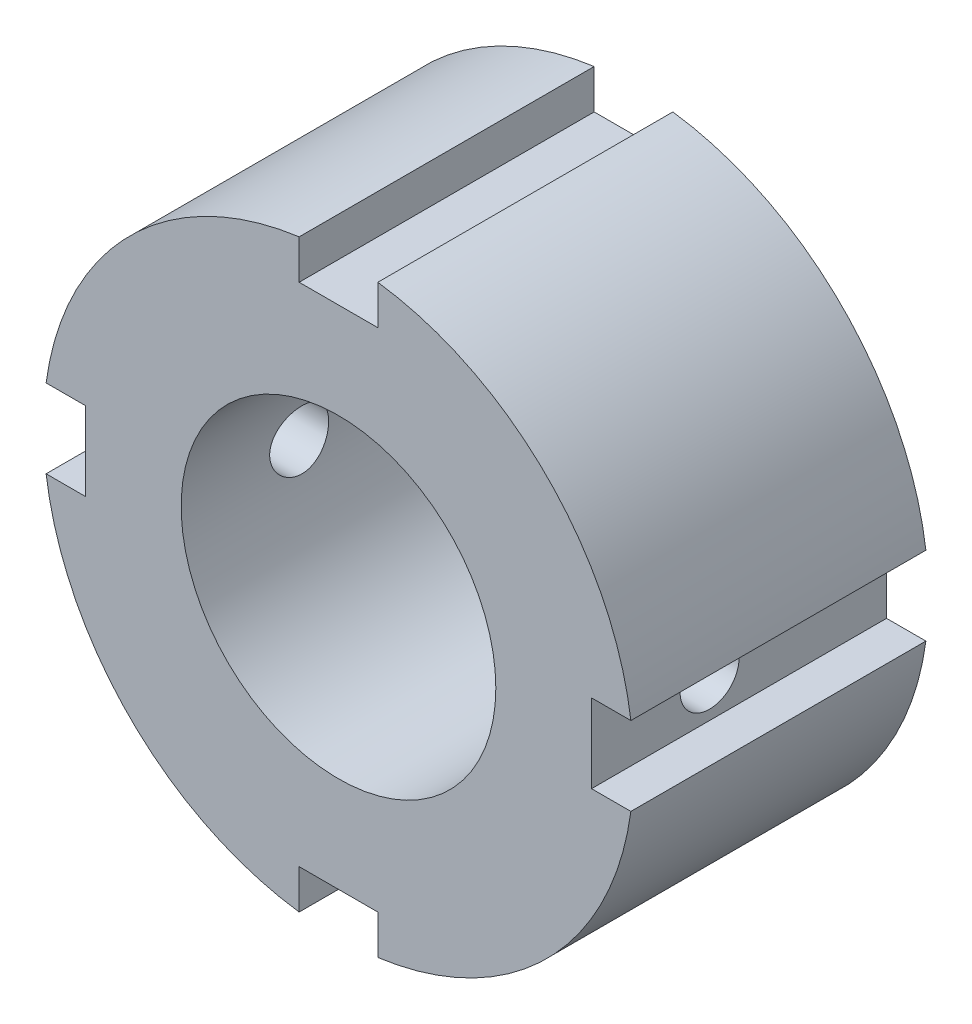
ISO-10303-21;
HEADER;
FILE_DESCRIPTION(('STEP AP214'),'2;1');
FILE_NAME('part.step','',(''),(''),'','','');
FILE_SCHEMA(('AUTOMOTIVE_DESIGN { 1 0 10303 214 1 1 1 1 }'));
ENDSEC;
DATA;
#1=APPLICATION_CONTEXT('core data for automotive mechanical design processes');
#2=APPLICATION_PROTOCOL_DEFINITION('international standard','automotive_design',2000,#1);
#3=PRODUCT_CONTEXT('',#1,'mechanical');
#4=PRODUCT('Part','Part','',(#3));
#5=PRODUCT_RELATED_PRODUCT_CATEGORY('part','',(#4));
#6=PRODUCT_DEFINITION_FORMATION('','',#4);
#7=PRODUCT_DEFINITION_CONTEXT('part definition',#1,'design');
#8=PRODUCT_DEFINITION('design','',#6,#7);
#9=PRODUCT_DEFINITION_SHAPE('','',#8);
#10=(LENGTH_UNIT() NAMED_UNIT(*) SI_UNIT(.MILLI.,.METRE.));
#11=(NAMED_UNIT(*) PLANE_ANGLE_UNIT() SI_UNIT($,.RADIAN.));
#12=(NAMED_UNIT(*) SI_UNIT($,.STERADIAN.) SOLID_ANGLE_UNIT());
#13=UNCERTAINTY_MEASURE_WITH_UNIT(LENGTH_MEASURE(1.E-05),#10,'distance_accuracy_value','');
#14=(GEOMETRIC_REPRESENTATION_CONTEXT(3) GLOBAL_UNCERTAINTY_ASSIGNED_CONTEXT((#13)) GLOBAL_UNIT_ASSIGNED_CONTEXT((#10,
#11,#12)) REPRESENTATION_CONTEXT('',''));
#15=CARTESIAN_POINT('',(0.,0.,0.));
#16=DIRECTION('',(0.,0.,1.));
#17=DIRECTION('',(1.,0.,0.));
#18=AXIS2_PLACEMENT_3D('',#15,#16,#17);
#19=CARTESIAN_POINT('',(0.,2.,15.));
#20=DIRECTION('',(0.,1.,0.));
#21=DIRECTION('',(0.,0.,1.));
#22=AXIS2_PLACEMENT_3D('',#19,#20,#21);
#23=PLANE('',#22);
#24=DIRECTION('',(1.,0.,0.));
#25=VECTOR('',#24,1.);
#26=CARTESIAN_POINT('',(0.,2.,0.));
#27=LINE('',#26,#25);
#28=CARTESIAN_POINT('',(12.8660687473185,2.,0.));
#29=VERTEX_POINT('',#28);
#30=CARTESIAN_POINT('',(14.8660687473185,2.,0.));
#31=VERTEX_POINT('',#30);
#32=EDGE_CURVE('E200',#29,#31,#27,.T.);
#33=ORIENTED_EDGE('',*,*,#32,.T.);
#34=DIRECTION('',(0.,0.,-1.));
#35=VECTOR('',#34,1.);
#36=CARTESIAN_POINT('',(14.8660687473185,2.,15.));
#37=LINE('',#36,#35);
#38=CARTESIAN_POINT('',(14.8660687473185,2.,15.));
#39=VERTEX_POINT('',#38);
#40=EDGE_CURVE('E11',#39,#31,#37,.T.);
#41=ORIENTED_EDGE('',*,*,#40,.F.);
#42=DIRECTION('',(1.,0.,0.));
#43=VECTOR('',#42,1.);
#44=CARTESIAN_POINT('',(0.,2.,15.));
#45=LINE('',#44,#43);
#46=CARTESIAN_POINT('',(12.8660687473185,2.,15.));
#47=VERTEX_POINT('',#46);
#48=EDGE_CURVE('E315',#47,#39,#45,.T.);
#49=ORIENTED_EDGE('',*,*,#48,.F.);
#50=DIRECTION('',(0.,0.,-1.));
#51=VECTOR('',#50,1.);
#52=CARTESIAN_POINT('',(12.8660687473185,2.,15.));
#53=LINE('',#52,#51);
#54=EDGE_CURVE('E61',#47,#29,#53,.T.);
#55=ORIENTED_EDGE('',*,*,#54,.T.);
#56=EDGE_LOOP('',(#33,#41,#49,#55));
#57=FACE_BOUND('',#56,.T.);
#58=ADVANCED_FACE('F41',(#57),#23,.F.);
#59=CARTESIAN_POINT('',(0.,0.,15.));
#60=DIRECTION('',(0.,0.,-1.));
#61=DIRECTION('',(-1.,0.,0.));
#62=AXIS2_PLACEMENT_3D('',#59,#60,#61);
#63=CYLINDRICAL_SURFACE('',#62,15.);
#64=CARTESIAN_POINT('',(0.,0.,0.));
#65=DIRECTION('',(0.,0.,1.));
#66=DIRECTION('',(1.,0.,0.));
#67=AXIS2_PLACEMENT_3D('',#64,#65,#66);
#68=CIRCLE('',#67,15.);
#69=CARTESIAN_POINT('',(2.,14.8660687473185,0.));
#70=VERTEX_POINT('',#69);
#71=EDGE_CURVE('E204',#31,#70,#68,.T.);
#72=ORIENTED_EDGE('',*,*,#71,.T.);
#73=DIRECTION('',(0.,0.,-1.));
#74=VECTOR('',#73,1.);
#75=CARTESIAN_POINT('',(2.,14.8660687473185,15.));
#76=LINE('',#75,#74);
#77=CARTESIAN_POINT('',(2.,14.8660687473185,15.));
#78=VERTEX_POINT('',#77);
#79=EDGE_CURVE('E53',#78,#70,#76,.T.);
#80=ORIENTED_EDGE('',*,*,#79,.F.);
#81=CARTESIAN_POINT('',(0.,0.,15.));
#82=DIRECTION('',(0.,0.,1.));
#83=DIRECTION('',(1.,0.,0.));
#84=AXIS2_PLACEMENT_3D('',#81,#82,#83);
#85=CIRCLE('',#84,15.);
#86=EDGE_CURVE('E123',#39,#78,#85,.T.);
#87=ORIENTED_EDGE('',*,*,#86,.F.);
#88=ORIENTED_EDGE('',*,*,#40,.T.);
#89=EDGE_LOOP('',(#72,#80,#87,#88));
#90=FACE_BOUND('',#89,.T.);
#91=ADVANCED_FACE('F296',(#90),#63,.T.);
#92=CARTESIAN_POINT('',(2.00000000000001,0.,15.));
#93=DIRECTION('',(-1.,0.,0.));
#94=DIRECTION('',(0.,-1.,0.));
#95=AXIS2_PLACEMENT_3D('',#92,#93,#94);
#96=PLANE('',#95);
#97=DIRECTION('',(0.,1.,0.));
#98=VECTOR('',#97,1.);
#99=CARTESIAN_POINT('',(2.00000000000001,0.,0.));
#100=LINE('',#99,#98);
#101=CARTESIAN_POINT('',(2.,12.8660687473185,0.));
#102=VERTEX_POINT('',#101);
#103=EDGE_CURVE('E208',#102,#70,#100,.T.);
#104=ORIENTED_EDGE('',*,*,#103,.F.);
#105=DIRECTION('',(0.,0.,-1.));
#106=VECTOR('',#105,1.);
#107=CARTESIAN_POINT('',(2.,12.8660687473185,15.));
#108=LINE('',#107,#106);
#109=CARTESIAN_POINT('',(2.,12.8660687473185,15.));
#110=VERTEX_POINT('',#109);
#111=EDGE_CURVE('E286',#110,#102,#108,.T.);
#112=ORIENTED_EDGE('',*,*,#111,.F.);
#113=DIRECTION('',(0.,1.,0.));
#114=VECTOR('',#113,1.);
#115=CARTESIAN_POINT('',(2.00000000000001,0.,15.));
#116=LINE('',#115,#114);
#117=EDGE_CURVE('E295',#110,#78,#116,.T.);
#118=ORIENTED_EDGE('',*,*,#117,.T.);
#119=ORIENTED_EDGE('',*,*,#79,.T.);
#120=EDGE_LOOP('',(#104,#112,#118,#119));
#121=FACE_BOUND('',#120,.T.);
#122=ADVANCED_FACE('F293',(#121),#96,.T.);
#123=CARTESIAN_POINT('',(0.,12.8660687473185,15.));
#124=DIRECTION('',(0.,1.,0.));
#125=DIRECTION('',(0.,0.,1.));
#126=AXIS2_PLACEMENT_3D('',#123,#124,#125);
#127=PLANE('',#126);
#128=DIRECTION('',(1.,0.,0.));
#129=VECTOR('',#128,1.);
#130=CARTESIAN_POINT('',(0.,12.8660687473185,0.));
#131=LINE('',#130,#129);
#132=CARTESIAN_POINT('',(-2.,12.8660687473185,0.));
#133=VERTEX_POINT('',#132);
#134=EDGE_CURVE('E213',#133,#102,#131,.T.);
#135=ORIENTED_EDGE('',*,*,#134,.F.);
#136=DIRECTION('',(0.,0.,-1.));
#137=VECTOR('',#136,1.);
#138=CARTESIAN_POINT('',(-2.,12.8660687473185,15.));
#139=LINE('',#138,#137);
#140=CARTESIAN_POINT('',(-2.,12.8660687473185,15.));
#141=VERTEX_POINT('',#140);
#142=EDGE_CURVE('E283',#141,#133,#139,.T.);
#143=ORIENTED_EDGE('',*,*,#142,.F.);
#144=DIRECTION('',(1.,0.,0.));
#145=VECTOR('',#144,1.);
#146=CARTESIAN_POINT('',(0.,12.8660687473185,15.));
#147=LINE('',#146,#145);
#148=EDGE_CURVE('E308',#141,#110,#147,.T.);
#149=ORIENTED_EDGE('',*,*,#148,.T.);
#150=ORIENTED_EDGE('',*,*,#111,.T.);
#151=EDGE_LOOP('',(#135,#143,#149,#150));
#152=FACE_BOUND('',#151,.T.);
#153=ADVANCED_FACE('F304',(#152),#127,.T.);
#154=CARTESIAN_POINT('',(-2.00000000000001,0.,15.));
#155=DIRECTION('',(-1.,0.,0.));
#156=DIRECTION('',(0.,-1.,0.));
#157=AXIS2_PLACEMENT_3D('',#154,#155,#156);
#158=PLANE('',#157);
#159=DIRECTION('',(0.,1.,0.));
#160=VECTOR('',#159,1.);
#161=CARTESIAN_POINT('',(-2.00000000000001,0.,0.));
#162=LINE('',#161,#160);
#163=CARTESIAN_POINT('',(-2.,14.8660687473185,0.));
#164=VERTEX_POINT('',#163);
#165=EDGE_CURVE('E217',#133,#164,#162,.T.);
#166=ORIENTED_EDGE('',*,*,#165,.T.);
#167=DIRECTION('',(0.,0.,-1.));
#168=VECTOR('',#167,1.);
#169=CARTESIAN_POINT('',(-2.,14.8660687473185,15.));
#170=LINE('',#169,#168);
#171=CARTESIAN_POINT('',(-2.,14.8660687473185,15.));
#172=VERTEX_POINT('',#171);
#173=EDGE_CURVE('E279',#172,#164,#170,.T.);
#174=ORIENTED_EDGE('',*,*,#173,.F.);
#175=DIRECTION('',(0.,1.,0.));
#176=VECTOR('',#175,1.);
#177=CARTESIAN_POINT('',(-2.00000000000001,0.,15.));
#178=LINE('',#177,#176);
#179=EDGE_CURVE('E313',#141,#172,#178,.T.);
#180=ORIENTED_EDGE('',*,*,#179,.F.);
#181=ORIENTED_EDGE('',*,*,#142,.T.);
#182=EDGE_LOOP('',(#166,#174,#180,#181));
#183=FACE_BOUND('',#182,.T.);
#184=ADVANCED_FACE('F400',(#183),#158,.F.);
#185=CARTESIAN_POINT('',(-14.8660687473185,2.,0.));
#186=VERTEX_POINT('',#185);
#187=EDGE_CURVE('E209',#164,#186,#68,.T.);
#188=ORIENTED_EDGE('',*,*,#187,.T.);
#189=DIRECTION('',(0.,0.,-1.));
#190=VECTOR('',#189,1.);
#191=CARTESIAN_POINT('',(-14.8660687473185,2.,15.));
#192=LINE('',#191,#190);
#193=CARTESIAN_POINT('',(-14.8660687473185,2.,15.));
#194=VERTEX_POINT('',#193);
#195=EDGE_CURVE('E276',#194,#186,#192,.T.);
#196=ORIENTED_EDGE('',*,*,#195,.F.);
#197=EDGE_CURVE('E316',#172,#194,#85,.T.);
#198=ORIENTED_EDGE('',*,*,#197,.F.);
#199=ORIENTED_EDGE('',*,*,#173,.T.);
#200=EDGE_LOOP('',(#188,#196,#198,#199));
#201=FACE_BOUND('',#200,.T.);
#202=ADVANCED_FACE('F356',(#201),#63,.T.);
#203=CARTESIAN_POINT('',(0.,2.,15.));
#204=DIRECTION('',(0.,-1.,0.));
#205=DIRECTION('',(0.,0.,-1.));
#206=AXIS2_PLACEMENT_3D('',#203,#204,#205);
#207=PLANE('',#206);
#208=DIRECTION('',(-1.,0.,0.));
#209=VECTOR('',#208,1.);
#210=CARTESIAN_POINT('',(0.,2.,0.));
#211=LINE('',#210,#209);
#212=CARTESIAN_POINT('',(-12.8660687473185,2.,0.));
#213=VERTEX_POINT('',#212);
#214=EDGE_CURVE('E220',#213,#186,#211,.T.);
#215=ORIENTED_EDGE('',*,*,#214,.F.);
#216=DIRECTION('',(0.,0.,-1.));
#217=VECTOR('',#216,1.);
#218=CARTESIAN_POINT('',(-12.8660687473185,2.,15.));
#219=LINE('',#218,#217);
#220=CARTESIAN_POINT('',(-12.8660687473185,2.,15.));
#221=VERTEX_POINT('',#220);
#222=EDGE_CURVE('E273',#221,#213,#219,.T.);
#223=ORIENTED_EDGE('',*,*,#222,.F.);
#224=DIRECTION('',(-1.,0.,0.));
#225=VECTOR('',#224,1.);
#226=CARTESIAN_POINT('',(0.,2.,15.));
#227=LINE('',#226,#225);
#228=EDGE_CURVE('E321',#221,#194,#227,.T.);
#229=ORIENTED_EDGE('',*,*,#228,.T.);
#230=ORIENTED_EDGE('',*,*,#195,.T.);
#231=EDGE_LOOP('',(#215,#223,#229,#230));
#232=FACE_BOUND('',#231,.T.);
#233=ADVANCED_FACE('F363',(#232),#207,.T.);
#234=CARTESIAN_POINT('',(-12.8660687473185,0.,15.));
#235=DIRECTION('',(1.,0.,0.));
#236=DIRECTION('',(0.,0.,-1.));
#237=AXIS2_PLACEMENT_3D('',#234,#235,#236);
#238=PLANE('',#237);
#239=CARTESIAN_POINT('',(-12.8660687473185,0.,9.));
#240=DIRECTION('',(1.,0.,0.));
#241=DIRECTION('',(0.,0.,-1.));
#242=AXIS2_PLACEMENT_3D('',#239,#240,#241);
#243=CIRCLE('',#242,1.5);
#244=CARTESIAN_POINT('',(-12.8660687473185,0.,7.5));
#245=VERTEX_POINT('',#244);
#246=EDGE_CURVE('E201',#245,#245,#243,.T.);
#247=ORIENTED_EDGE('',*,*,#246,.T.);
#248=EDGE_LOOP('',(#247));
#249=FACE_BOUND('',#248,.T.);
#250=DIRECTION('',(0.,-1.,0.));
#251=VECTOR('',#250,1.);
#252=CARTESIAN_POINT('',(-12.8660687473185,0.,0.));
#253=LINE('',#252,#251);
#254=CARTESIAN_POINT('',(-12.8660687473185,-2.,0.));
#255=VERTEX_POINT('',#254);
#256=EDGE_CURVE('E224',#213,#255,#253,.T.);
#257=ORIENTED_EDGE('',*,*,#256,.T.);
#258=DIRECTION('',(0.,0.,-1.));
#259=VECTOR('',#258,1.);
#260=CARTESIAN_POINT('',(-12.8660687473185,-2.,15.));
#261=LINE('',#260,#259);
#262=CARTESIAN_POINT('',(-12.8660687473185,-2.,15.));
#263=VERTEX_POINT('',#262);
#264=EDGE_CURVE('E269',#263,#255,#261,.T.);
#265=ORIENTED_EDGE('',*,*,#264,.F.);
#266=DIRECTION('',(0.,-1.,0.));
#267=VECTOR('',#266,1.);
#268=CARTESIAN_POINT('',(-12.8660687473185,0.,15.));
#269=LINE('',#268,#267);
#270=EDGE_CURVE('E325',#221,#263,#269,.T.);
#271=ORIENTED_EDGE('',*,*,#270,.F.);
#272=ORIENTED_EDGE('',*,*,#222,.T.);
#273=EDGE_LOOP('',(#257,#265,#271,#272));
#274=FACE_BOUND('',#273,.T.);
#275=ADVANCED_FACE('F379',(#249,#274),#238,.F.);
#276=CARTESIAN_POINT('',(0.,-2.,15.));
#277=DIRECTION('',(0.,-1.,0.));
#278=DIRECTION('',(0.,0.,-1.));
#279=AXIS2_PLACEMENT_3D('',#276,#277,#278);
#280=PLANE('',#279);
#281=DIRECTION('',(-1.,0.,0.));
#282=VECTOR('',#281,1.);
#283=CARTESIAN_POINT('',(0.,-2.,0.));
#284=LINE('',#283,#282);
#285=CARTESIAN_POINT('',(-14.8660687473185,-2.,0.));
#286=VERTEX_POINT('',#285);
#287=EDGE_CURVE('E227',#255,#286,#284,.T.);
#288=ORIENTED_EDGE('',*,*,#287,.T.);
#289=DIRECTION('',(0.,0.,-1.));
#290=VECTOR('',#289,1.);
#291=CARTESIAN_POINT('',(-14.8660687473185,-2.,15.));
#292=LINE('',#291,#290);
#293=CARTESIAN_POINT('',(-14.8660687473185,-2.,15.));
#294=VERTEX_POINT('',#293);
#295=EDGE_CURVE('E265',#294,#286,#292,.T.);
#296=ORIENTED_EDGE('',*,*,#295,.F.);
#297=DIRECTION('',(-1.,0.,0.));
#298=VECTOR('',#297,1.);
#299=CARTESIAN_POINT('',(0.,-2.,15.));
#300=LINE('',#299,#298);
#301=EDGE_CURVE('E328',#263,#294,#300,.T.);
#302=ORIENTED_EDGE('',*,*,#301,.F.);
#303=ORIENTED_EDGE('',*,*,#264,.T.);
#304=EDGE_LOOP('',(#288,#296,#302,#303));
#305=FACE_BOUND('',#304,.T.);
#306=ADVANCED_FACE('F377',(#305),#280,.F.);
#307=CARTESIAN_POINT('',(-2.,-14.8660687473185,0.));
#308=VERTEX_POINT('',#307);
#309=EDGE_CURVE('E230',#286,#308,#68,.T.);
#310=ORIENTED_EDGE('',*,*,#309,.T.);
#311=DIRECTION('',(0.,0.,-1.));
#312=VECTOR('',#311,1.);
#313=CARTESIAN_POINT('',(-2.,-14.8660687473185,15.));
#314=LINE('',#313,#312);
#315=CARTESIAN_POINT('',(-2.,-14.8660687473185,15.));
#316=VERTEX_POINT('',#315);
#317=EDGE_CURVE('E262',#316,#308,#314,.T.);
#318=ORIENTED_EDGE('',*,*,#317,.F.);
#319=EDGE_CURVE('E176',#294,#316,#85,.T.);
#320=ORIENTED_EDGE('',*,*,#319,.F.);
#321=ORIENTED_EDGE('',*,*,#295,.T.);
#322=EDGE_LOOP('',(#310,#318,#320,#321));
#323=FACE_BOUND('',#322,.T.);
#324=ADVANCED_FACE('F372',(#323),#63,.T.);
#325=CARTESIAN_POINT('',(-2.00000000000001,0.,15.));
#326=DIRECTION('',(1.,0.,0.));
#327=DIRECTION('',(0.,1.,0.));
#328=AXIS2_PLACEMENT_3D('',#325,#326,#327);
#329=PLANE('',#328);
#330=DIRECTION('',(0.,-1.,0.));
#331=VECTOR('',#330,1.);
#332=CARTESIAN_POINT('',(-2.00000000000001,0.,0.));
#333=LINE('',#332,#331);
#334=CARTESIAN_POINT('',(-2.,-12.8660687473185,0.));
#335=VERTEX_POINT('',#334);
#336=EDGE_CURVE('E231',#335,#308,#333,.T.);
#337=ORIENTED_EDGE('',*,*,#336,.F.);
#338=DIRECTION('',(0.,0.,-1.));
#339=VECTOR('',#338,1.);
#340=CARTESIAN_POINT('',(-2.,-12.8660687473185,15.));
#341=LINE('',#340,#339);
#342=CARTESIAN_POINT('',(-2.,-12.8660687473185,15.));
#343=VERTEX_POINT('',#342);
#344=EDGE_CURVE('E259',#343,#335,#341,.T.);
#345=ORIENTED_EDGE('',*,*,#344,.F.);
#346=DIRECTION('',(0.,-1.,0.));
#347=VECTOR('',#346,1.);
#348=CARTESIAN_POINT('',(-2.00000000000001,0.,15.));
#349=LINE('',#348,#347);
#350=EDGE_CURVE('E331',#343,#316,#349,.T.);
#351=ORIENTED_EDGE('',*,*,#350,.T.);
#352=ORIENTED_EDGE('',*,*,#317,.T.);
#353=EDGE_LOOP('',(#337,#345,#351,#352));
#354=FACE_BOUND('',#353,.T.);
#355=ADVANCED_FACE('F375',(#354),#329,.T.);
#356=CARTESIAN_POINT('',(0.,-12.8660687473185,15.));
#357=DIRECTION('',(0.,1.,0.));
#358=DIRECTION('',(0.,0.,1.));
#359=AXIS2_PLACEMENT_3D('',#356,#357,#358);
#360=PLANE('',#359);
#361=DIRECTION('',(1.,0.,0.));
#362=VECTOR('',#361,1.);
#363=CARTESIAN_POINT('',(0.,-12.8660687473185,0.));
#364=LINE('',#363,#362);
#365=CARTESIAN_POINT('',(2.,-12.8660687473185,0.));
#366=VERTEX_POINT('',#365);
#367=EDGE_CURVE('E235',#335,#366,#364,.T.);
#368=ORIENTED_EDGE('',*,*,#367,.T.);
#369=DIRECTION('',(0.,0.,-1.));
#370=VECTOR('',#369,1.);
#371=CARTESIAN_POINT('',(2.,-12.8660687473185,15.));
#372=LINE('',#371,#370);
#373=CARTESIAN_POINT('',(2.,-12.8660687473185,15.));
#374=VERTEX_POINT('',#373);
#375=EDGE_CURVE('E255',#374,#366,#372,.T.);
#376=ORIENTED_EDGE('',*,*,#375,.F.);
#377=DIRECTION('',(1.,0.,0.));
#378=VECTOR('',#377,1.);
#379=CARTESIAN_POINT('',(0.,-12.8660687473185,15.));
#380=LINE('',#379,#378);
#381=EDGE_CURVE('E334',#343,#374,#380,.T.);
#382=ORIENTED_EDGE('',*,*,#381,.F.);
#383=ORIENTED_EDGE('',*,*,#344,.T.);
#384=EDGE_LOOP('',(#368,#376,#382,#383));
#385=FACE_BOUND('',#384,.T.);
#386=ADVANCED_FACE('F341',(#385),#360,.F.);
#387=CARTESIAN_POINT('',(2.00000000000001,0.,15.));
#388=DIRECTION('',(1.,0.,0.));
#389=DIRECTION('',(0.,1.,0.));
#390=AXIS2_PLACEMENT_3D('',#387,#388,#389);
#391=PLANE('',#390);
#392=DIRECTION('',(0.,-1.,0.));
#393=VECTOR('',#392,1.);
#394=CARTESIAN_POINT('',(2.00000000000001,0.,0.));
#395=LINE('',#394,#393);
#396=CARTESIAN_POINT('',(2.,-14.8660687473185,0.));
#397=VERTEX_POINT('',#396);
#398=EDGE_CURVE('E238',#366,#397,#395,.T.);
#399=ORIENTED_EDGE('',*,*,#398,.T.);
#400=DIRECTION('',(0.,0.,-1.));
#401=VECTOR('',#400,1.);
#402=CARTESIAN_POINT('',(2.,-14.8660687473185,15.));
#403=LINE('',#402,#401);
#404=CARTESIAN_POINT('',(2.,-14.8660687473185,15.));
#405=VERTEX_POINT('',#404);
#406=EDGE_CURVE('E185',#405,#397,#403,.T.);
#407=ORIENTED_EDGE('',*,*,#406,.F.);
#408=DIRECTION('',(0.,-1.,0.));
#409=VECTOR('',#408,1.);
#410=CARTESIAN_POINT('',(2.00000000000001,0.,15.));
#411=LINE('',#410,#409);
#412=EDGE_CURVE('E170',#374,#405,#411,.T.);
#413=ORIENTED_EDGE('',*,*,#412,.F.);
#414=ORIENTED_EDGE('',*,*,#375,.T.);
#415=EDGE_LOOP('',(#399,#407,#413,#414));
#416=FACE_BOUND('',#415,.T.);
#417=ADVANCED_FACE('F345',(#416),#391,.F.);
#418=CARTESIAN_POINT('',(14.8660687473185,-2.,0.));
#419=VERTEX_POINT('',#418);
#420=EDGE_CURVE('E181',#397,#419,#68,.T.);
#421=ORIENTED_EDGE('',*,*,#420,.T.);
#422=DIRECTION('',(0.,0.,-1.));
#423=VECTOR('',#422,1.);
#424=CARTESIAN_POINT('',(14.8660687473185,-2.,15.));
#425=LINE('',#424,#423);
#426=CARTESIAN_POINT('',(14.8660687473185,-2.,15.));
#427=VERTEX_POINT('',#426);
#428=EDGE_CURVE('E178',#427,#419,#425,.T.);
#429=ORIENTED_EDGE('',*,*,#428,.F.);
#430=EDGE_CURVE('E163',#405,#427,#85,.T.);
#431=ORIENTED_EDGE('',*,*,#430,.F.);
#432=ORIENTED_EDGE('',*,*,#406,.T.);
#433=EDGE_LOOP('',(#421,#429,#431,#432));
#434=FACE_BOUND('',#433,.T.);
#435=ADVANCED_FACE('F179',(#434),#63,.T.);
#436=CARTESIAN_POINT('',(0.,-2.,15.));
#437=DIRECTION('',(0.,1.,0.));
#438=DIRECTION('',(0.,0.,1.));
#439=AXIS2_PLACEMENT_3D('',#436,#437,#438);
#440=PLANE('',#439);
#441=DIRECTION('',(1.,0.,0.));
#442=VECTOR('',#441,1.);
#443=CARTESIAN_POINT('',(0.,-2.,0.));
#444=LINE('',#443,#442);
#445=CARTESIAN_POINT('',(12.8660687473185,-2.,0.));
#446=VERTEX_POINT('',#445);
#447=EDGE_CURVE('E241',#446,#419,#444,.T.);
#448=ORIENTED_EDGE('',*,*,#447,.F.);
#449=DIRECTION('',(0.,0.,-1.));
#450=VECTOR('',#449,1.);
#451=CARTESIAN_POINT('',(12.8660687473185,-2.,15.));
#452=LINE('',#451,#450);
#453=CARTESIAN_POINT('',(12.8660687473185,-2.,15.));
#454=VERTEX_POINT('',#453);
#455=EDGE_CURVE('E111',#454,#446,#452,.T.);
#456=ORIENTED_EDGE('',*,*,#455,.F.);
#457=DIRECTION('',(1.,0.,0.));
#458=VECTOR('',#457,1.);
#459=CARTESIAN_POINT('',(0.,-2.,15.));
#460=LINE('',#459,#458);
#461=EDGE_CURVE('E168',#454,#427,#460,.T.);
#462=ORIENTED_EDGE('',*,*,#461,.T.);
#463=ORIENTED_EDGE('',*,*,#428,.T.);
#464=EDGE_LOOP('',(#448,#456,#462,#463));
#465=FACE_BOUND('',#464,.T.);
#466=ADVANCED_FACE('F187',(#465),#440,.T.);
#467=CARTESIAN_POINT('',(0.,0.,15.));
#468=DIRECTION('',(0.,0.,-1.));
#469=DIRECTION('',(-1.,0.,0.));
#470=AXIS2_PLACEMENT_3D('',#467,#468,#469);
#471=CYLINDRICAL_SURFACE('',#470,7.99999999999999);
#472=CARTESIAN_POINT('',(-7.99999999999999,0.,10.5));
#473=CARTESIAN_POINT('',(-7.99999848833851,-0.0834717464654709,10.4999968104117));
#474=CARTESIAN_POINT('',(-7.99868009921714,-0.166984992730099,10.4930089233806));
#475=CARTESIAN_POINT('',(-7.99354785890519,-0.331658129841798,10.4652600048817));
#476=CARTESIAN_POINT('',(-7.98973190166896,-0.412815974152226,10.4444873493603));
#477=CARTESIAN_POINT('',(-7.98003138765457,-0.570372961851802,10.3898272987407));
#478=CARTESIAN_POINT('',(-7.97414869946482,-0.646776330685344,10.3559517475475));
#479=CARTESIAN_POINT('',(-7.96095710599782,-0.792807973094007,10.2760811230772));
#480=CARTESIAN_POINT('',(-7.95364831618289,-0.862436794477323,10.2300870308552));
#481=CARTESIAN_POINT('',(-7.93831336430503,-0.993783715930504,10.1267002319963));
#482=CARTESIAN_POINT('',(-7.93028034856351,-1.05540895503183,10.0691905553299));
#483=CARTESIAN_POINT('',(-7.9144531845865,-1.16819606135369,9.94465669091244));
#484=CARTESIAN_POINT('',(-7.90665905354527,-1.21935717689242,9.87763182023071));
#485=CARTESIAN_POINT('',(-7.89212551245005,-1.31014998665793,9.73531391163603));
#486=CARTESIAN_POINT('',(-7.88539493886181,-1.34968721969605,9.65995962968276));
#487=CARTESIAN_POINT('',(-7.87384713211987,-1.41550524332283,9.50353108482321));
#488=CARTESIAN_POINT('',(-7.86902973396962,-1.44178717713098,9.42245731588878));
#489=CARTESIAN_POINT('',(-7.86192269574549,-1.480050535035,9.25788476908559));
#490=CARTESIAN_POINT('',(-7.85960445366404,-1.49219390192039,9.17442490279654));
#491=CARTESIAN_POINT('',(-7.85767197152761,-1.50233808095346,9.00662261519175));
#492=CARTESIAN_POINT('',(-7.85805748898759,-1.50034016135374,8.9222802736977));
#493=CARTESIAN_POINT('',(-7.86146292701752,-1.48238979602362,8.75628047473395));
#494=CARTESIAN_POINT('',(-7.86444808147333,-1.46662149996045,8.67460228569985));
#495=CARTESIAN_POINT('',(-7.87266183284666,-1.42186799396207,8.51507158021739));
#496=CARTESIAN_POINT('',(-7.87789052509515,-1.39288222239499,8.4372192264907));
#497=CARTESIAN_POINT('',(-7.89003855292588,-1.322336471793,8.28701132099973));
#498=CARTESIAN_POINT('',(-7.89696783823365,-1.28070213532456,8.21469152941919));
#499=CARTESIAN_POINT('',(-7.91172971602917,-1.18609368930416,8.07799527145977));
#500=CARTESIAN_POINT('',(-7.91956240015522,-1.13311842889266,8.0136196122852));
#501=CARTESIAN_POINT('',(-7.93540001272163,-1.01633905685298,7.89357504432754));
#502=CARTESIAN_POINT('',(-7.9434057102403,-0.952377436860682,7.83805934754826));
#503=CARTESIAN_POINT('',(-7.95857386108317,-0.815968037098826,7.73852275932459));
#504=CARTESIAN_POINT('',(-7.96573630595245,-0.743520172255769,7.69450198312958));
#505=CARTESIAN_POINT('',(-7.97842539677508,-0.592034988874667,7.61918224612998));
#506=CARTESIAN_POINT('',(-7.98394999136288,-0.512989564446493,7.5878992208821));
#507=CARTESIAN_POINT('',(-7.99272505402719,-0.350639115398696,7.53909790690784));
#508=CARTESIAN_POINT('',(-7.99597576367993,-0.267334544277786,7.52157815595464));
#509=CARTESIAN_POINT('',(-7.9998036064198,-0.100148652903384,7.50101396898173));
#510=CARTESIAN_POINT('',(-8.00041950912278,-0.0162940126341344,7.49775960847027));
#511=CARTESIAN_POINT('',(-7.99901543598227,0.150761248092185,7.50525547954765));
#512=CARTESIAN_POINT('',(-7.99699558964431,0.233961900480386,7.51600502306526));
#513=CARTESIAN_POINT('',(-7.99057111500406,0.396681573218218,7.55102903518337));
#514=CARTESIAN_POINT('',(-7.9861852237403,0.476224261046064,7.57519728253781));
#515=CARTESIAN_POINT('',(-7.97551842212498,0.630128631824634,7.63625770677879));
#516=CARTESIAN_POINT('',(-7.96923738311334,0.704489962595104,7.67315074756578));
#517=CARTESIAN_POINT('',(-7.95538030357665,0.846816671513215,7.75907812815951));
#518=CARTESIAN_POINT('',(-7.94779086174562,0.914703277015122,7.80824073853684));
#519=CARTESIAN_POINT('',(-7.93219343489711,1.04133832326455,7.91713813736236));
#520=CARTESIAN_POINT('',(-7.92418541084686,1.10008590976087,7.97687391300133));
#521=CARTESIAN_POINT('',(-7.90852475697449,1.20757295872048,8.10617231891142));
#522=CARTESIAN_POINT('',(-7.90087825860256,1.25616916218577,8.17585490812539));
#523=CARTESIAN_POINT('',(-7.88692985578531,1.34096675057787,8.32251762452375));
#524=CARTESIAN_POINT('',(-7.88062790137349,1.37716859613924,8.39949748037047));
#525=CARTESIAN_POINT('',(-7.87013024209573,1.43594673512823,8.55820586724254));
#526=CARTESIAN_POINT('',(-7.86592440436878,1.45858868794786,8.63990937955933));
#527=CARTESIAN_POINT('',(-7.86007203802415,1.48980679326236,8.8060472225214));
#528=CARTESIAN_POINT('',(-7.85842522065789,1.49838453270708,8.8904812439704));
#529=CARTESIAN_POINT('',(-7.85789199803856,1.50117762148355,9.05824833144151));
#530=CARTESIAN_POINT('',(-7.85896215974293,1.49561895003499,9.141577580957));
#531=CARTESIAN_POINT('',(-7.86364600659998,1.47079175378803,9.30609142204529));
#532=CARTESIAN_POINT('',(-7.86725967655746,1.45152331089332,9.38727602642744));
#533=CARTESIAN_POINT('',(-7.87660508023179,1.39991887583263,9.54507448479548));
#534=CARTESIAN_POINT('',(-7.88233284594964,1.36760735397252,9.62169659134577));
#535=CARTESIAN_POINT('',(-7.89526387551839,1.29085868912204,9.76846825424084));
#536=CARTESIAN_POINT('',(-7.90246724360119,1.24642068948186,9.83861735284478));
#537=CARTESIAN_POINT('',(-7.91767266107744,1.14589487339535,9.97158368004229));
#538=CARTESIAN_POINT('',(-7.92568505353043,1.08964259864303,10.0342754125671));
#539=CARTESIAN_POINT('',(-7.94152833918734,0.96742792674229,10.1494051624645));
#540=CARTESIAN_POINT('',(-7.94935919027327,0.901463301891615,10.2018408209801));
#541=CARTESIAN_POINT('',(-7.96403975968048,0.760984945071872,10.2954109526271));
#542=CARTESIAN_POINT('',(-7.9708800099056,0.686399590640515,10.3364394284906));
#543=CARTESIAN_POINT('',(-7.98271619380686,0.531290113653832,10.4053176366051));
#544=CARTESIAN_POINT('',(-7.98771385879036,0.450771651705246,10.4331797470469));
#545=CARTESIAN_POINT('',(-7.99428290707631,0.308347202825153,10.4692773144187));
#546=CARTESIAN_POINT('',(-7.99641470878206,0.24727381025187,10.4807786303128));
#547=CARTESIAN_POINT('',(-7.9992737995401,0.124141247115158,10.4961410621164));
#548=CARTESIAN_POINT('',(-8.00000112429804,0.0620821016527093,10.5000023722559));
#549=CARTESIAN_POINT('',(-7.99999999999999,0.,10.5));
#550=B_SPLINE_CURVE_WITH_KNOTS('',3,(#472,#473,#474,#475,#476,#477,#478,#479,#480,#481,#482,
#483,#484,#485,#486,#487,#488,#489,#490,#491,#492,#493,#494,#495,#496,#497,#498,#499,#500,#501,
#502,#503,#504,#505,#506,#507,#508,#509,#510,#511,#512,#513,#514,#515,#516,#517,#518,#519,#520,
#521,#522,#523,#524,#525,#526,#527,#528,#529,#530,#531,#532,#533,#534,#535,#536,#537,#538,#539,
#540,#541,#542,#543,#544,#545,#546,#547,#548,#549),.UNSPECIFIED.,.T.,.F.,(4,2,2,2,2,2,2,2,2,2,2,
2,2,2,2,2,2,2,2,2,2,2,2,2,2,2,2,2,2,2,2,2,2,2,2,2,2,2,4),(0.,0.250188200964924,
0.500587642535452,0.750761271230908,1.00091465336891,1.25375118013631,1.50660586283617,
1.76146190504358,2.01629596311949,2.26818151445336,2.52004447587256,2.76859000612766,
3.01714609846787,3.26719262629531,3.5172645404986,3.77127768464077,4.02529337544948,
4.27962588321699,4.53393136673746,4.78448174076097,5.03501980464584,5.28360233907829,
5.53220175338032,5.78351778017709,6.03485728413098,6.28953436987299,6.54420198954945,
6.79762627818559,7.05102196946513,7.30039252231749,7.54976158541507,7.79866496207693,
8.04758592655423,8.30023369966381,8.55293951262256,8.80792048916315,9.06266126931174,
9.2487434452441,9.43482089039541),.UNSPECIFIED.);
#551=CARTESIAN_POINT('',(-7.99999999999999,0.,10.5));
#552=VERTEX_POINT('',#551);
#553=EDGE_CURVE('E541',#552,#552,#550,.T.);
#554=ORIENTED_EDGE('',*,*,#553,.F.);
#555=EDGE_LOOP('',(#554));
#556=FACE_BOUND('',#555,.T.);
#557=CARTESIAN_POINT('',(7.99999999999999,0.,7.5));
#558=CARTESIAN_POINT('',(7.99999848833851,-0.0834717464654708,7.50000318958828));
#559=CARTESIAN_POINT('',(7.99868009921714,-0.166984992730098,7.50699107661938));
#560=CARTESIAN_POINT('',(7.99354785890519,-0.331658129841798,7.53473999511835));
#561=CARTESIAN_POINT('',(7.98973190166896,-0.412815974152226,7.55551265063973));
#562=CARTESIAN_POINT('',(7.98003138765457,-0.570372961851801,7.61017270125934));
#563=CARTESIAN_POINT('',(7.97414869946482,-0.646776330685344,7.64404825245254));
#564=CARTESIAN_POINT('',(7.96095710599782,-0.792807973094006,7.72391887692282));
#565=CARTESIAN_POINT('',(7.95364831618289,-0.862436794477323,7.76991296914482));
#566=CARTESIAN_POINT('',(7.93831336430504,-0.993783715930503,7.87329976800367));
#567=CARTESIAN_POINT('',(7.93028034856351,-1.05540895503183,7.93080944467013));
#568=CARTESIAN_POINT('',(7.9144531845865,-1.16819606135369,8.05534330908756));
#569=CARTESIAN_POINT('',(7.90665905354527,-1.21935717689242,8.12236817976929));
#570=CARTESIAN_POINT('',(7.89212551245005,-1.31014998665793,8.26468608836397));
#571=CARTESIAN_POINT('',(7.88539493886181,-1.34968721969605,8.34004037031723));
#572=CARTESIAN_POINT('',(7.87384713211987,-1.41550524332283,8.49646891517679));
#573=CARTESIAN_POINT('',(7.86902973396962,-1.44178717713098,8.57754268411122));
#574=CARTESIAN_POINT('',(7.86192269574549,-1.480050535035,8.74211523091441));
#575=CARTESIAN_POINT('',(7.85960445366404,-1.49219390192039,8.82557509720346));
#576=CARTESIAN_POINT('',(7.85767197152761,-1.50233808095346,8.99337738480825));
#577=CARTESIAN_POINT('',(7.85805748898759,-1.50034016135374,9.0777197263023));
#578=CARTESIAN_POINT('',(7.86146292701752,-1.48238979602362,9.24371952526604));
#579=CARTESIAN_POINT('',(7.86444808147333,-1.46662149996045,9.32539771430015));
#580=CARTESIAN_POINT('',(7.87266183284666,-1.42186799396207,9.48492841978261));
#581=CARTESIAN_POINT('',(7.87789052509515,-1.39288222239499,9.5627807735093));
#582=CARTESIAN_POINT('',(7.89003855292588,-1.322336471793,9.71298867900027));
#583=CARTESIAN_POINT('',(7.89696783823365,-1.28070213532456,9.78530847058081));
#584=CARTESIAN_POINT('',(7.91172971602917,-1.18609368930416,9.92200472854023));
#585=CARTESIAN_POINT('',(7.91956240015522,-1.13311842889266,9.9863803877148));
#586=CARTESIAN_POINT('',(7.93540001272163,-1.01633905685298,10.1064249556725));
#587=CARTESIAN_POINT('',(7.9434057102403,-0.952377436860683,10.1619406524517));
#588=CARTESIAN_POINT('',(7.95857386108317,-0.815968037098827,10.2614772406754));
#589=CARTESIAN_POINT('',(7.96573630595245,-0.74352017225577,10.3054980168704));
#590=CARTESIAN_POINT('',(7.97842539677508,-0.592034988874669,10.38081775387));
#591=CARTESIAN_POINT('',(7.98394999136288,-0.512989564446494,10.4121007791179));
#592=CARTESIAN_POINT('',(7.99272505402719,-0.350639115398697,10.4609020930922));
#593=CARTESIAN_POINT('',(7.99597576367993,-0.267334544277787,10.4784218440454));
#594=CARTESIAN_POINT('',(7.9998036064198,-0.100148652903385,10.4989860310183));
#595=CARTESIAN_POINT('',(8.00041950912278,-0.0162940126341355,10.5022403915297));
#596=CARTESIAN_POINT('',(7.99901543598227,0.150761248092184,10.4947445204524));
#597=CARTESIAN_POINT('',(7.99699558964431,0.233961900480385,10.4839949769347));
#598=CARTESIAN_POINT('',(7.99057111500406,0.396681573218217,10.4489709648166));
#599=CARTESIAN_POINT('',(7.9861852237403,0.476224261046063,10.4248027174622));
#600=CARTESIAN_POINT('',(7.97551842212498,0.630128631824633,10.3637422932212));
#601=CARTESIAN_POINT('',(7.96923738311334,0.704489962595103,10.3268492524342));
#602=CARTESIAN_POINT('',(7.95538030357665,0.846816671513214,10.2409218718405));
#603=CARTESIAN_POINT('',(7.94779086174562,0.914703277015122,10.1917592614632));
#604=CARTESIAN_POINT('',(7.93219343489711,1.04133832326455,10.0828618626376));
#605=CARTESIAN_POINT('',(7.92418541084686,1.10008590976087,10.0231260869987));
#606=CARTESIAN_POINT('',(7.90852475697449,1.20757295872048,9.89382768108857));
#607=CARTESIAN_POINT('',(7.90087825860256,1.25616916218577,9.82414509187461));
#608=CARTESIAN_POINT('',(7.88692985578531,1.34096675057787,9.67748237547625));
#609=CARTESIAN_POINT('',(7.88062790137349,1.37716859613924,9.60050251962953));
#610=CARTESIAN_POINT('',(7.87013024209573,1.43594673512823,9.44179413275746));
#611=CARTESIAN_POINT('',(7.86592440436878,1.45858868794786,9.36009062044067));
#612=CARTESIAN_POINT('',(7.86007203802415,1.48980679326236,9.1939527774786));
#613=CARTESIAN_POINT('',(7.85842522065789,1.49838453270708,9.1095187560296));
#614=CARTESIAN_POINT('',(7.85789199803856,1.50117762148355,8.94175166855849));
#615=CARTESIAN_POINT('',(7.85896215974293,1.49561895003499,8.858422419043));
#616=CARTESIAN_POINT('',(7.86364600659998,1.47079175378803,8.69390857795471));
#617=CARTESIAN_POINT('',(7.86725967655746,1.45152331089332,8.61272397357256));
#618=CARTESIAN_POINT('',(7.87660508023179,1.39991887583263,8.45492551520452));
#619=CARTESIAN_POINT('',(7.88233284594964,1.36760735397252,8.37830340865423));
#620=CARTESIAN_POINT('',(7.89526387551839,1.29085868912204,8.23153174575916));
#621=CARTESIAN_POINT('',(7.90246724360119,1.24642068948186,8.16138264715522));
#622=CARTESIAN_POINT('',(7.91767266107744,1.14589487339535,8.0284163199577));
#623=CARTESIAN_POINT('',(7.92568505353043,1.08964259864304,7.9657245874329));
#624=CARTESIAN_POINT('',(7.94152833918734,0.967427926742291,7.85059483753548));
#625=CARTESIAN_POINT('',(7.94935919027327,0.901463301891616,7.79815917901986));
#626=CARTESIAN_POINT('',(7.96403975968048,0.760984945071872,7.70458904737294));
#627=CARTESIAN_POINT('',(7.9708800099056,0.686399590640516,7.66356057150936));
#628=CARTESIAN_POINT('',(7.98271619380686,0.531290113653833,7.59468236339486));
#629=CARTESIAN_POINT('',(7.98771385879036,0.450771651705248,7.56682025295309));
#630=CARTESIAN_POINT('',(7.99428290707631,0.308347202825154,7.53072268558132));
#631=CARTESIAN_POINT('',(7.99641470878206,0.24727381025187,7.5192213696872));
#632=CARTESIAN_POINT('',(7.9992737995401,0.124141247115157,7.50385893788355));
#633=CARTESIAN_POINT('',(8.00000112429804,0.0620821016527093,7.49999762774409));
#634=CARTESIAN_POINT('',(7.99999999999999,0.,7.5));
#635=B_SPLINE_CURVE_WITH_KNOTS('',3,(#557,#558,#559,#560,#561,#562,#563,#564,#565,#566,#567,
#568,#569,#570,#571,#572,#573,#574,#575,#576,#577,#578,#579,#580,#581,#582,#583,#584,#585,#586,
#587,#588,#589,#590,#591,#592,#593,#594,#595,#596,#597,#598,#599,#600,#601,#602,#603,#604,#605,
#606,#607,#608,#609,#610,#611,#612,#613,#614,#615,#616,#617,#618,#619,#620,#621,#622,#623,#624,
#625,#626,#627,#628,#629,#630,#631,#632,#633,#634),.UNSPECIFIED.,.T.,.F.,(4,2,2,2,2,2,2,2,2,2,2,
2,2,2,2,2,2,2,2,2,2,2,2,2,2,2,2,2,2,2,2,2,2,2,2,2,2,2,4),(0.,0.250188200964924,
0.500587642535452,0.750761271230907,1.00091465336891,1.25375118013631,1.50660586283617,
1.76146190504358,2.01629596311949,2.26818151445336,2.52004447587256,2.76859000612766,
3.01714609846787,3.26719262629531,3.51726454049859,3.77127768464077,4.02529337544948,
4.27962588321699,4.53393136673745,4.78448174076097,5.03501980464583,5.28360233907828,
5.53220175338032,5.78351778017709,6.03485728413098,6.28953436987299,6.54420198954945,
6.79762627818559,7.05102196946513,7.30039252231748,7.54976158541507,7.79866496207692,
8.04758592655423,8.30023369966381,8.55293951262256,8.80792048916315,9.06266126931174,
9.2487434452441,9.43482089039541),.UNSPECIFIED.);
#636=CARTESIAN_POINT('',(7.99999999999999,0.,7.5));
#637=VERTEX_POINT('',#636);
#638=EDGE_CURVE('E536',#637,#637,#635,.T.);
#639=ORIENTED_EDGE('',*,*,#638,.F.);
#640=EDGE_LOOP('',(#639));
#641=FACE_BOUND('',#640,.T.);
#642=CARTESIAN_POINT('',(0.,0.,15.));
#643=DIRECTION('',(0.,0.,1.));
#644=DIRECTION('',(1.,0.,0.));
#645=AXIS2_PLACEMENT_3D('',#642,#643,#644);
#646=CIRCLE('',#645,7.99999999999999);
#647=CARTESIAN_POINT('',(7.99999999999999,0.,15.));
#648=VERTEX_POINT('',#647);
#649=EDGE_CURVE('E248',#648,#648,#646,.T.);
#650=ORIENTED_EDGE('',*,*,#649,.T.);
#651=EDGE_LOOP('',(#650));
#652=FACE_BOUND('',#651,.T.);
#653=CARTESIAN_POINT('',(0.,0.,0.));
#654=DIRECTION('',(0.,0.,1.));
#655=DIRECTION('',(1.,0.,0.));
#656=AXIS2_PLACEMENT_3D('',#653,#654,#655);
#657=CIRCLE('',#656,7.99999999999999);
#658=CARTESIAN_POINT('',(7.99999999999999,0.,0.));
#659=VERTEX_POINT('',#658);
#660=EDGE_CURVE('E196',#659,#659,#657,.T.);
#661=ORIENTED_EDGE('',*,*,#660,.F.);
#662=EDGE_LOOP('',(#661));
#663=FACE_BOUND('',#662,.T.);
#664=ADVANCED_FACE('F43',(#556,#641,#652,#663),#471,.F.);
#665=CARTESIAN_POINT('',(12.8660687473185,0.,15.));
#666=DIRECTION('',(1.,0.,0.));
#667=DIRECTION('',(0.,0.,-1.));
#668=AXIS2_PLACEMENT_3D('',#665,#666,#667);
#669=PLANE('',#668);
#670=CARTESIAN_POINT('',(12.8660687473185,0.,9.));
#671=DIRECTION('',(1.,0.,0.));
#672=DIRECTION('',(0.,0.,-1.));
#673=AXIS2_PLACEMENT_3D('',#670,#671,#672);
#674=CIRCLE('',#673,1.5);
#675=CARTESIAN_POINT('',(12.8660687473185,0.,7.5));
#676=VERTEX_POINT('',#675);
#677=EDGE_CURVE('E46',#676,#676,#674,.T.);
#678=ORIENTED_EDGE('',*,*,#677,.F.);
#679=EDGE_LOOP('',(#678));
#680=FACE_BOUND('',#679,.T.);
#681=DIRECTION('',(0.,-1.,0.));
#682=VECTOR('',#681,1.);
#683=CARTESIAN_POINT('',(12.8660687473185,0.,0.));
#684=LINE('',#683,#682);
#685=EDGE_CURVE('E244',#29,#446,#684,.T.);
#686=ORIENTED_EDGE('',*,*,#685,.F.);
#687=ORIENTED_EDGE('',*,*,#54,.F.);
#688=DIRECTION('',(0.,-1.,0.));
#689=VECTOR('',#688,1.);
#690=CARTESIAN_POINT('',(12.8660687473185,0.,15.));
#691=LINE('',#690,#689);
#692=EDGE_CURVE('E189',#47,#454,#691,.T.);
#693=ORIENTED_EDGE('',*,*,#692,.T.);
#694=ORIENTED_EDGE('',*,*,#455,.T.);
#695=EDGE_LOOP('',(#686,#687,#693,#694));
#696=FACE_BOUND('',#695,.T.);
#697=ADVANCED_FACE('F494',(#680,#696),#669,.T.);
#698=CARTESIAN_POINT('',(0.,0.,15.));
#699=DIRECTION('',(0.,0.,1.));
#700=DIRECTION('',(1.,0.,0.));
#701=AXIS2_PLACEMENT_3D('',#698,#699,#700);
#702=PLANE('',#701);
#703=ORIENTED_EDGE('',*,*,#649,.F.);
#704=EDGE_LOOP('',(#703));
#705=FACE_BOUND('',#704,.T.);
#706=ORIENTED_EDGE('',*,*,#48,.T.);
#707=ORIENTED_EDGE('',*,*,#86,.T.);
#708=ORIENTED_EDGE('',*,*,#117,.F.);
#709=ORIENTED_EDGE('',*,*,#148,.F.);
#710=ORIENTED_EDGE('',*,*,#179,.T.);
#711=ORIENTED_EDGE('',*,*,#197,.T.);
#712=ORIENTED_EDGE('',*,*,#228,.F.);
#713=ORIENTED_EDGE('',*,*,#270,.T.);
#714=ORIENTED_EDGE('',*,*,#301,.T.);
#715=ORIENTED_EDGE('',*,*,#319,.T.);
#716=ORIENTED_EDGE('',*,*,#350,.F.);
#717=ORIENTED_EDGE('',*,*,#381,.T.);
#718=ORIENTED_EDGE('',*,*,#412,.T.);
#719=ORIENTED_EDGE('',*,*,#430,.T.);
#720=ORIENTED_EDGE('',*,*,#461,.F.);
#721=ORIENTED_EDGE('',*,*,#692,.F.);
#722=EDGE_LOOP('',(#706,#707,#708,#709,#710,#711,#712,#713,#714,#715,#716,#717,#718,#719,#720,#721));
#723=FACE_BOUND('',#722,.T.);
#724=ADVANCED_FACE('F165',(#705,#723),#702,.T.);
#725=CARTESIAN_POINT('',(0.,0.,0.));
#726=DIRECTION('',(0.,0.,1.));
#727=DIRECTION('',(1.,0.,0.));
#728=AXIS2_PLACEMENT_3D('',#725,#726,#727);
#729=PLANE('',#728);
#730=ORIENTED_EDGE('',*,*,#660,.T.);
#731=EDGE_LOOP('',(#730));
#732=FACE_BOUND('',#731,.T.);
#733=ORIENTED_EDGE('',*,*,#32,.F.);
#734=ORIENTED_EDGE('',*,*,#685,.T.);
#735=ORIENTED_EDGE('',*,*,#447,.T.);
#736=ORIENTED_EDGE('',*,*,#420,.F.);
#737=ORIENTED_EDGE('',*,*,#398,.F.);
#738=ORIENTED_EDGE('',*,*,#367,.F.);
#739=ORIENTED_EDGE('',*,*,#336,.T.);
#740=ORIENTED_EDGE('',*,*,#309,.F.);
#741=ORIENTED_EDGE('',*,*,#287,.F.);
#742=ORIENTED_EDGE('',*,*,#256,.F.);
#743=ORIENTED_EDGE('',*,*,#214,.T.);
#744=ORIENTED_EDGE('',*,*,#187,.F.);
#745=ORIENTED_EDGE('',*,*,#165,.F.);
#746=ORIENTED_EDGE('',*,*,#134,.T.);
#747=ORIENTED_EDGE('',*,*,#103,.T.);
#748=ORIENTED_EDGE('',*,*,#71,.F.);
#749=EDGE_LOOP('',(#733,#734,#735,#736,#737,#738,#739,#740,#741,#742,#743,#744,#745,#746,#747,#748));
#750=FACE_BOUND('',#749,.T.);
#751=ADVANCED_FACE('F299',(#732,#750),#729,.F.);
#752=CARTESIAN_POINT('',(-14.8660687473185,0.,9.));
#753=DIRECTION('',(1.,0.,0.));
#754=DIRECTION('',(0.,0.,-1.));
#755=AXIS2_PLACEMENT_3D('',#752,#753,#754);
#756=CYLINDRICAL_SURFACE('',#755,1.5);
#757=ORIENTED_EDGE('',*,*,#638,.T.);
#758=EDGE_LOOP('',(#757));
#759=FACE_BOUND('',#758,.T.);
#760=ORIENTED_EDGE('',*,*,#677,.T.);
#761=EDGE_LOOP('',(#760));
#762=FACE_BOUND('',#761,.T.);
#763=ADVANCED_FACE('F511',(#759,#762),#756,.F.);
#764=ORIENTED_EDGE('',*,*,#553,.T.);
#765=EDGE_LOOP('',(#764));
#766=FACE_BOUND('',#765,.T.);
#767=ORIENTED_EDGE('',*,*,#246,.F.);
#768=EDGE_LOOP('',(#767));
#769=FACE_BOUND('',#768,.T.);
#770=ADVANCED_FACE('F516',(#766,#769),#756,.F.);
#771=CLOSED_SHELL('',(#58,#91,#122,#153,#184,#202,#233,#275,#306,#324,#355,#386,#417,#435,#466,
#664,#697,#724,#751,#763,#770));
#772=MANIFOLD_SOLID_BREP('B2',#771);
#773=ADVANCED_BREP_SHAPE_REPRESENTATION('',(#18,#772),#14);
#774=SHAPE_DEFINITION_REPRESENTATION(#9,#773);
ENDSEC;
END-ISO-10303-21;
